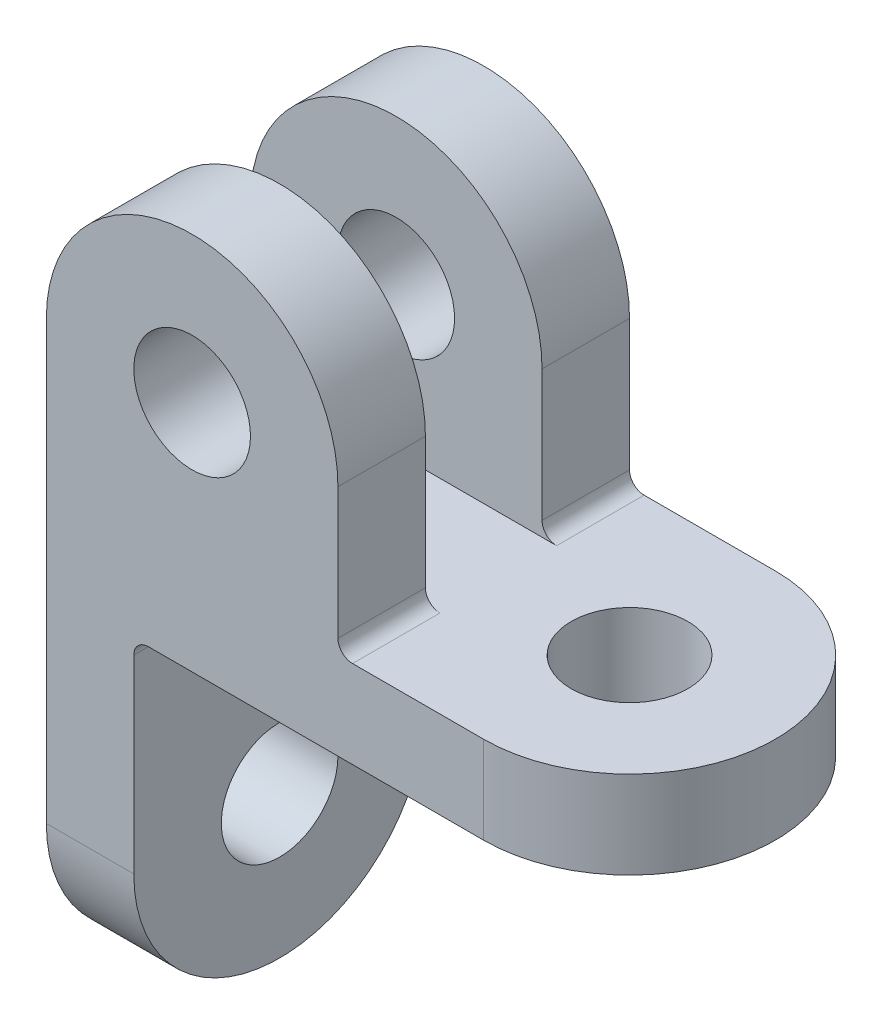
ISO-10303-21;
HEADER;
FILE_DESCRIPTION(('STEP AP214'),'2;1');
FILE_NAME('part.step','',(''),(''),'','','');
FILE_SCHEMA(('AUTOMOTIVE_DESIGN { 1 0 10303 214 1 1 1 1 }'));
ENDSEC;
DATA;
#1=APPLICATION_CONTEXT('core data for automotive mechanical design processes');
#2=APPLICATION_PROTOCOL_DEFINITION('international standard','automotive_design',2000,#1);
#3=PRODUCT_CONTEXT('',#1,'mechanical');
#4=PRODUCT('Part','Part','',(#3));
#5=PRODUCT_RELATED_PRODUCT_CATEGORY('part','',(#4));
#6=PRODUCT_DEFINITION_FORMATION('','',#4);
#7=PRODUCT_DEFINITION_CONTEXT('part definition',#1,'design');
#8=PRODUCT_DEFINITION('design','',#6,#7);
#9=PRODUCT_DEFINITION_SHAPE('','',#8);
#10=(LENGTH_UNIT() NAMED_UNIT(*) SI_UNIT(.MILLI.,.METRE.));
#11=(NAMED_UNIT(*) PLANE_ANGLE_UNIT() SI_UNIT($,.RADIAN.));
#12=(NAMED_UNIT(*) SI_UNIT($,.STERADIAN.) SOLID_ANGLE_UNIT());
#13=UNCERTAINTY_MEASURE_WITH_UNIT(LENGTH_MEASURE(1.E-05),#10,'distance_accuracy_value','');
#14=(GEOMETRIC_REPRESENTATION_CONTEXT(3) GLOBAL_UNCERTAINTY_ASSIGNED_CONTEXT((#13)) GLOBAL_UNIT_ASSIGNED_CONTEXT((#10,
#11,#12)) REPRESENTATION_CONTEXT('',''));
#15=CARTESIAN_POINT('',(0.,0.,0.));
#16=DIRECTION('',(0.,0.,1.));
#17=DIRECTION('',(1.,0.,0.));
#18=AXIS2_PLACEMENT_3D('',#15,#16,#17);
#19=CARTESIAN_POINT('',(0.,15.,0.));
#20=DIRECTION('',(-1.,0.,0.));
#21=DIRECTION('',(0.,-1.,0.));
#22=AXIS2_PLACEMENT_3D('',#19,#20,#21);
#23=CYLINDRICAL_SURFACE('',#22,15.);
#24=DIRECTION('',(-1.,0.,0.));
#25=VECTOR('',#24,1.);
#26=CARTESIAN_POINT('',(0.,15.,15.));
#27=LINE('',#26,#25);
#28=CARTESIAN_POINT('',(0.,15.,15.));
#29=VERTEX_POINT('',#28);
#30=CARTESIAN_POINT('',(8.99999999999999,15.,15.));
#31=VERTEX_POINT('',#30);
#32=EDGE_CURVE('E289',#29,#31,#27,.F.);
#33=ORIENTED_EDGE('',*,*,#32,.F.);
#34=CARTESIAN_POINT('',(0.,15.,0.));
#35=DIRECTION('',(1.,0.,0.));
#36=DIRECTION('',(0.,1.,0.));
#37=AXIS2_PLACEMENT_3D('',#34,#35,#36);
#38=CIRCLE('',#37,15.);
#39=CARTESIAN_POINT('',(0.,15.,-15.));
#40=VERTEX_POINT('',#39);
#41=EDGE_CURVE('E295',#40,#29,#38,.F.);
#42=ORIENTED_EDGE('',*,*,#41,.F.);
#43=DIRECTION('',(1.,0.,0.));
#44=VECTOR('',#43,1.);
#45=CARTESIAN_POINT('',(0.,15.,-15.));
#46=LINE('',#45,#44);
#47=CARTESIAN_POINT('',(8.99999999999999,15.,-15.));
#48=VERTEX_POINT('',#47);
#49=EDGE_CURVE('E162',#48,#40,#46,.F.);
#50=ORIENTED_EDGE('',*,*,#49,.F.);
#51=CARTESIAN_POINT('',(8.99999999999999,15.,0.));
#52=DIRECTION('',(1.,0.,0.));
#53=DIRECTION('',(0.,0.,-1.));
#54=AXIS2_PLACEMENT_3D('',#51,#52,#53);
#55=CIRCLE('',#54,15.);
#56=EDGE_CURVE('E298',#31,#48,#55,.T.);
#57=ORIENTED_EDGE('',*,*,#56,.F.);
#58=EDGE_LOOP('',(#33,#42,#50,#57));
#59=FACE_BOUND('',#58,.T.);
#60=ADVANCED_FACE('F47',(#59),#23,.T.);
#61=CARTESIAN_POINT('',(45.,36.,0.));
#62=DIRECTION('',(0.,-1.,0.));
#63=DIRECTION('',(0.,0.,-1.));
#64=AXIS2_PLACEMENT_3D('',#61,#62,#63);
#65=CYLINDRICAL_SURFACE('',#64,15.);
#66=DIRECTION('',(0.,-1.,0.));
#67=VECTOR('',#66,1.);
#68=CARTESIAN_POINT('',(45.,0.,15.));
#69=LINE('',#68,#67);
#70=CARTESIAN_POINT('',(45.,36.,15.));
#71=VERTEX_POINT('',#70);
#72=CARTESIAN_POINT('',(45.,45.,15.));
#73=VERTEX_POINT('',#72);
#74=EDGE_CURVE('E274',#71,#73,#69,.F.);
#75=ORIENTED_EDGE('',*,*,#74,.F.);
#76=CARTESIAN_POINT('',(45.,36.,0.));
#77=DIRECTION('',(0.,-1.,0.));
#78=DIRECTION('',(1.,0.,0.));
#79=AXIS2_PLACEMENT_3D('',#76,#77,#78);
#80=CIRCLE('',#79,15.);
#81=CARTESIAN_POINT('',(45.,36.,-15.));
#82=VERTEX_POINT('',#81);
#83=EDGE_CURVE('E282',#82,#71,#80,.T.);
#84=ORIENTED_EDGE('',*,*,#83,.F.);
#85=DIRECTION('',(0.,1.,0.));
#86=VECTOR('',#85,1.);
#87=CARTESIAN_POINT('',(45.,36.,-15.));
#88=LINE('',#87,#86);
#89=CARTESIAN_POINT('',(45.,45.,-15.));
#90=VERTEX_POINT('',#89);
#91=EDGE_CURVE('E278',#90,#82,#88,.F.);
#92=ORIENTED_EDGE('',*,*,#91,.F.);
#93=CARTESIAN_POINT('',(45.,45.,0.));
#94=DIRECTION('',(0.,1.,0.));
#95=DIRECTION('',(-1.,0.,0.));
#96=AXIS2_PLACEMENT_3D('',#93,#94,#95);
#97=CIRCLE('',#96,15.);
#98=EDGE_CURVE('E285',#73,#90,#97,.T.);
#99=ORIENTED_EDGE('',*,*,#98,.F.);
#100=EDGE_LOOP('',(#75,#84,#92,#99));
#101=FACE_BOUND('',#100,.T.);
#102=ADVANCED_FACE('F372',(#101),#65,.T.);
#103=CARTESIAN_POINT('',(0.,45.,15.));
#104=DIRECTION('',(0.,1.,0.));
#105=DIRECTION('',(-1.,0.,0.));
#106=AXIS2_PLACEMENT_3D('',#103,#104,#105);
#107=PLANE('',#106);
#108=CARTESIAN_POINT('',(45.,45.,0.));
#109=DIRECTION('',(0.,1.,0.));
#110=DIRECTION('',(0.,0.,1.));
#111=AXIS2_PLACEMENT_3D('',#108,#109,#110);
#112=CIRCLE('',#111,6.);
#113=CARTESIAN_POINT('',(45.,45.,6.));
#114=VERTEX_POINT('',#113);
#115=EDGE_CURVE('E637',#114,#114,#112,.T.);
#116=ORIENTED_EDGE('',*,*,#115,.F.);
#117=EDGE_LOOP('',(#116));
#118=FACE_BOUND('',#117,.T.);
#119=DIRECTION('',(1.,0.,0.));
#120=VECTOR('',#119,1.);
#121=CARTESIAN_POINT('',(0.,45.,-15.));
#122=LINE('',#121,#120);
#123=CARTESIAN_POINT('',(31.5,45.,-15.));
#124=VERTEX_POINT('',#123);
#125=EDGE_CURVE('E166',#124,#90,#122,.T.);
#126=ORIENTED_EDGE('',*,*,#125,.F.);
#127=DIRECTION('',(0.,0.,1.));
#128=VECTOR('',#127,1.);
#129=CARTESIAN_POINT('',(31.5,45.,15.));
#130=LINE('',#129,#128);
#131=CARTESIAN_POINT('',(31.5,45.,-6.));
#132=VERTEX_POINT('',#131);
#133=EDGE_CURVE('E305',#124,#132,#130,.T.);
#134=ORIENTED_EDGE('',*,*,#133,.T.);
#135=DIRECTION('',(-1.,0.,0.));
#136=VECTOR('',#135,1.);
#137=CARTESIAN_POINT('',(0.,45.,-6.));
#138=LINE('',#137,#136);
#139=CARTESIAN_POINT('',(0.,45.,-6.));
#140=VERTEX_POINT('',#139);
#141=EDGE_CURVE('E203',#132,#140,#138,.T.);
#142=ORIENTED_EDGE('',*,*,#141,.T.);
#143=DIRECTION('',(0.,0.,-1.));
#144=VECTOR('',#143,1.);
#145=CARTESIAN_POINT('',(0.,45.,15.));
#146=LINE('',#145,#144);
#147=CARTESIAN_POINT('',(0.,45.,6.));
#148=VERTEX_POINT('',#147);
#149=EDGE_CURVE('E265',#148,#140,#146,.T.);
#150=ORIENTED_EDGE('',*,*,#149,.F.);
#151=DIRECTION('',(-1.,0.,0.));
#152=VECTOR('',#151,1.);
#153=CARTESIAN_POINT('',(0.,45.,6.));
#154=LINE('',#153,#152);
#155=CARTESIAN_POINT('',(31.5,45.,6.));
#156=VERTEX_POINT('',#155);
#157=EDGE_CURVE('E238',#156,#148,#154,.T.);
#158=ORIENTED_EDGE('',*,*,#157,.F.);
#159=DIRECTION('',(0.,0.,-1.));
#160=VECTOR('',#159,1.);
#161=CARTESIAN_POINT('',(31.5,45.,15.));
#162=LINE('',#161,#160);
#163=CARTESIAN_POINT('',(31.5,45.,15.));
#164=VERTEX_POINT('',#163);
#165=EDGE_CURVE('E302',#156,#164,#162,.F.);
#166=ORIENTED_EDGE('',*,*,#165,.T.);
#167=DIRECTION('',(1.,0.,0.));
#168=VECTOR('',#167,1.);
#169=CARTESIAN_POINT('',(0.,45.,15.));
#170=LINE('',#169,#168);
#171=EDGE_CURVE('E250',#164,#73,#170,.T.);
#172=ORIENTED_EDGE('',*,*,#171,.T.);
#173=ORIENTED_EDGE('',*,*,#98,.T.);
#174=EDGE_LOOP('',(#126,#134,#142,#150,#158,#166,#172,#173));
#175=FACE_BOUND('',#174,.T.);
#176=ADVANCED_FACE('F374',(#118,#175),#107,.T.);
#177=CARTESIAN_POINT('',(0.,0.,15.));
#178=DIRECTION('',(1.,0.,0.));
#179=DIRECTION('',(0.,1.,0.));
#180=AXIS2_PLACEMENT_3D('',#177,#178,#179);
#181=PLANE('',#180);
#182=CARTESIAN_POINT('',(0.,15.,0.));
#183=DIRECTION('',(1.,0.,0.));
#184=DIRECTION('',(0.,1.,0.));
#185=AXIS2_PLACEMENT_3D('',#182,#183,#184);
#186=CIRCLE('',#185,6.);
#187=CARTESIAN_POINT('',(0.,21.,0.));
#188=VERTEX_POINT('',#187);
#189=EDGE_CURVE('E198',#188,#188,#186,.T.);
#190=ORIENTED_EDGE('',*,*,#189,.T.);
#191=EDGE_LOOP('',(#190));
#192=FACE_BOUND('',#191,.T.);
#193=DIRECTION('',(0.,-1.,0.));
#194=VECTOR('',#193,1.);
#195=CARTESIAN_POINT('',(0.,0.,-15.));
#196=LINE('',#195,#194);
#197=CARTESIAN_POINT('',(0.,60.,-15.));
#198=VERTEX_POINT('',#197);
#199=EDGE_CURVE('E153',#198,#40,#196,.T.);
#200=ORIENTED_EDGE('',*,*,#199,.T.);
#201=ORIENTED_EDGE('',*,*,#41,.T.);
#202=DIRECTION('',(0.,-1.,0.));
#203=VECTOR('',#202,1.);
#204=CARTESIAN_POINT('',(0.,0.,15.));
#205=LINE('',#204,#203);
#206=CARTESIAN_POINT('',(0.,60.,15.));
#207=VERTEX_POINT('',#206);
#208=EDGE_CURVE('E253',#207,#29,#205,.T.);
#209=ORIENTED_EDGE('',*,*,#208,.F.);
#210=DIRECTION('',(0.,0.,-1.));
#211=VECTOR('',#210,1.);
#212=CARTESIAN_POINT('',(0.,60.,15.));
#213=LINE('',#212,#211);
#214=CARTESIAN_POINT('',(0.,60.,6.));
#215=VERTEX_POINT('',#214);
#216=EDGE_CURVE('E247',#207,#215,#213,.T.);
#217=ORIENTED_EDGE('',*,*,#216,.T.);
#218=DIRECTION('',(0.,-1.,0.));
#219=VECTOR('',#218,1.);
#220=CARTESIAN_POINT('',(0.,0.,6.));
#221=LINE('',#220,#219);
#222=EDGE_CURVE('E234',#215,#148,#221,.T.);
#223=ORIENTED_EDGE('',*,*,#222,.T.);
#224=ORIENTED_EDGE('',*,*,#149,.T.);
#225=DIRECTION('',(0.,-1.,0.));
#226=VECTOR('',#225,1.);
#227=CARTESIAN_POINT('',(0.,0.,-6.));
#228=LINE('',#227,#226);
#229=CARTESIAN_POINT('',(0.,60.,-6.));
#230=VERTEX_POINT('',#229);
#231=EDGE_CURVE('E172',#230,#140,#228,.T.);
#232=ORIENTED_EDGE('',*,*,#231,.F.);
#233=DIRECTION('',(0.,0.,1.));
#234=VECTOR('',#233,1.);
#235=CARTESIAN_POINT('',(0.,60.,-15.));
#236=LINE('',#235,#234);
#237=EDGE_CURVE('E169',#198,#230,#236,.T.);
#238=ORIENTED_EDGE('',*,*,#237,.F.);
#239=EDGE_LOOP('',(#200,#201,#209,#217,#223,#224,#232,#238));
#240=FACE_BOUND('',#239,.T.);
#241=ADVANCED_FACE('F170',(#192,#240),#181,.F.);
#242=CARTESIAN_POINT('',(8.99999999999999,0.,15.));
#243=DIRECTION('',(1.,0.,0.));
#244=DIRECTION('',(0.,0.,-1.));
#245=AXIS2_PLACEMENT_3D('',#242,#243,#244);
#246=PLANE('',#245);
#247=CARTESIAN_POINT('',(9.,15.,0.));
#248=DIRECTION('',(1.,0.,0.));
#249=DIRECTION('',(0.,0.,-1.));
#250=AXIS2_PLACEMENT_3D('',#247,#248,#249);
#251=CIRCLE('',#250,6.);
#252=CARTESIAN_POINT('',(9.,15.,-6.));
#253=VERTEX_POINT('',#252);
#254=EDGE_CURVE('E628',#253,#253,#251,.T.);
#255=ORIENTED_EDGE('',*,*,#254,.F.);
#256=EDGE_LOOP('',(#255));
#257=FACE_BOUND('',#256,.T.);
#258=DIRECTION('',(0.,-1.,0.));
#259=VECTOR('',#258,1.);
#260=CARTESIAN_POINT('',(8.99999999999999,0.,-15.));
#261=LINE('',#260,#259);
#262=CARTESIAN_POINT('',(8.99999999999999,34.5,-15.));
#263=VERTEX_POINT('',#262);
#264=EDGE_CURVE('E165',#263,#48,#261,.T.);
#265=ORIENTED_EDGE('',*,*,#264,.F.);
#266=DIRECTION('',(0.,0.,-1.));
#267=VECTOR('',#266,1.);
#268=CARTESIAN_POINT('',(8.99999999999999,34.5,15.));
#269=LINE('',#268,#267);
#270=CARTESIAN_POINT('',(8.99999999999999,34.5,15.));
#271=VERTEX_POINT('',#270);
#272=EDGE_CURVE('E69',#263,#271,#269,.F.);
#273=ORIENTED_EDGE('',*,*,#272,.T.);
#274=DIRECTION('',(0.,-1.,0.));
#275=VECTOR('',#274,1.);
#276=CARTESIAN_POINT('',(8.99999999999999,0.,15.));
#277=LINE('',#276,#275);
#278=EDGE_CURVE('E258',#271,#31,#277,.T.);
#279=ORIENTED_EDGE('',*,*,#278,.T.);
#280=ORIENTED_EDGE('',*,*,#56,.T.);
#281=EDGE_LOOP('',(#265,#273,#279,#280));
#282=FACE_BOUND('',#281,.T.);
#283=ADVANCED_FACE('F359',(#257,#282),#246,.T.);
#284=CARTESIAN_POINT('',(0.,36.,15.));
#285=DIRECTION('',(0.,-1.,0.));
#286=DIRECTION('',(1.,0.,0.));
#287=AXIS2_PLACEMENT_3D('',#284,#285,#286);
#288=PLANE('',#287);
#289=CARTESIAN_POINT('',(45.,36.,0.));
#290=DIRECTION('',(0.,-1.,0.));
#291=DIRECTION('',(1.,0.,0.));
#292=AXIS2_PLACEMENT_3D('',#289,#290,#291);
#293=CIRCLE('',#292,6.);
#294=CARTESIAN_POINT('',(51.,36.,0.));
#295=VERTEX_POINT('',#294);
#296=EDGE_CURVE('E631',#295,#295,#293,.T.);
#297=ORIENTED_EDGE('',*,*,#296,.F.);
#298=EDGE_LOOP('',(#297));
#299=FACE_BOUND('',#298,.T.);
#300=DIRECTION('',(-1.,0.,0.));
#301=VECTOR('',#300,1.);
#302=CARTESIAN_POINT('',(0.,36.,15.));
#303=LINE('',#302,#301);
#304=CARTESIAN_POINT('',(10.5,36.,15.));
#305=VERTEX_POINT('',#304);
#306=EDGE_CURVE('E261',#71,#305,#303,.T.);
#307=ORIENTED_EDGE('',*,*,#306,.T.);
#308=DIRECTION('',(0.,0.,-1.));
#309=VECTOR('',#308,1.);
#310=CARTESIAN_POINT('',(10.5,36.,-15.));
#311=LINE('',#310,#309);
#312=CARTESIAN_POINT('',(10.5,36.,-15.));
#313=VERTEX_POINT('',#312);
#314=EDGE_CURVE('E316',#305,#313,#311,.T.);
#315=ORIENTED_EDGE('',*,*,#314,.T.);
#316=DIRECTION('',(-1.,0.,0.));
#317=VECTOR('',#316,1.);
#318=CARTESIAN_POINT('',(0.,36.,-15.));
#319=LINE('',#318,#317);
#320=EDGE_CURVE('E254',#82,#313,#319,.T.);
#321=ORIENTED_EDGE('',*,*,#320,.F.);
#322=ORIENTED_EDGE('',*,*,#83,.T.);
#323=EDGE_LOOP('',(#307,#315,#321,#322));
#324=FACE_BOUND('',#323,.T.);
#325=ADVANCED_FACE('F366',(#299,#324),#288,.T.);
#326=CARTESIAN_POINT('',(0.,0.,15.));
#327=DIRECTION('',(0.,0.,1.));
#328=DIRECTION('',(1.,0.,0.));
#329=AXIS2_PLACEMENT_3D('',#326,#327,#328);
#330=PLANE('',#329);
#331=ORIENTED_EDGE('',*,*,#208,.T.);
#332=ORIENTED_EDGE('',*,*,#32,.T.);
#333=ORIENTED_EDGE('',*,*,#278,.F.);
#334=CARTESIAN_POINT('',(10.5,34.5,15.));
#335=DIRECTION('',(0.,0.,1.));
#336=DIRECTION('',(1.,0.,0.));
#337=AXIS2_PLACEMENT_3D('',#334,#335,#336);
#338=CIRCLE('',#337,1.5);
#339=EDGE_CURVE('E11',#271,#305,#338,.F.);
#340=ORIENTED_EDGE('',*,*,#339,.T.);
#341=ORIENTED_EDGE('',*,*,#306,.F.);
#342=ORIENTED_EDGE('',*,*,#74,.T.);
#343=ORIENTED_EDGE('',*,*,#171,.F.);
#344=CARTESIAN_POINT('',(31.5,46.5,15.));
#345=DIRECTION('',(0.,0.,1.));
#346=DIRECTION('',(1.,0.,0.));
#347=AXIS2_PLACEMENT_3D('',#344,#345,#346);
#348=CIRCLE('',#347,1.5);
#349=CARTESIAN_POINT('',(30.,46.5,15.));
#350=VERTEX_POINT('',#349);
#351=EDGE_CURVE('E332',#164,#350,#348,.F.);
#352=ORIENTED_EDGE('',*,*,#351,.T.);
#353=DIRECTION('',(0.,-1.,0.));
#354=VECTOR('',#353,1.);
#355=CARTESIAN_POINT('',(30.,0.,15.));
#356=LINE('',#355,#354);
#357=CARTESIAN_POINT('',(30.,60.,15.));
#358=VERTEX_POINT('',#357);
#359=EDGE_CURVE('E222',#358,#350,#356,.T.);
#360=ORIENTED_EDGE('',*,*,#359,.F.);
#361=CARTESIAN_POINT('',(15.,60.,15.));
#362=DIRECTION('',(0.,0.,1.));
#363=DIRECTION('',(1.,0.,0.));
#364=AXIS2_PLACEMENT_3D('',#361,#362,#363);
#365=CIRCLE('',#364,15.);
#366=EDGE_CURVE('E217',#207,#358,#365,.F.);
#367=ORIENTED_EDGE('',*,*,#366,.F.);
#368=EDGE_LOOP('',(#331,#332,#333,#340,#341,#342,#343,#352,#360,#367));
#369=FACE_BOUND('',#368,.T.);
#370=CARTESIAN_POINT('',(15.,60.,15.));
#371=DIRECTION('',(0.,0.,1.));
#372=DIRECTION('',(1.,0.,0.));
#373=AXIS2_PLACEMENT_3D('',#370,#371,#372);
#374=CIRCLE('',#373,6.);
#375=CARTESIAN_POINT('',(21.,60.,15.));
#376=VERTEX_POINT('',#375);
#377=EDGE_CURVE('E213',#376,#376,#374,.T.);
#378=ORIENTED_EDGE('',*,*,#377,.F.);
#379=EDGE_LOOP('',(#378));
#380=FACE_BOUND('',#379,.T.);
#381=ADVANCED_FACE('F339',(#369,#380),#330,.T.);
#382=CARTESIAN_POINT('',(0.,0.,-15.));
#383=DIRECTION('',(0.,0.,1.));
#384=DIRECTION('',(1.,0.,0.));
#385=AXIS2_PLACEMENT_3D('',#382,#383,#384);
#386=PLANE('',#385);
#387=ORIENTED_EDGE('',*,*,#320,.T.);
#388=CARTESIAN_POINT('',(10.5,34.5,-15.));
#389=DIRECTION('',(0.,0.,1.));
#390=DIRECTION('',(1.,0.,0.));
#391=AXIS2_PLACEMENT_3D('',#388,#389,#390);
#392=CIRCLE('',#391,1.5);
#393=EDGE_CURVE('E56',#313,#263,#392,.T.);
#394=ORIENTED_EDGE('',*,*,#393,.T.);
#395=ORIENTED_EDGE('',*,*,#264,.T.);
#396=ORIENTED_EDGE('',*,*,#49,.T.);
#397=ORIENTED_EDGE('',*,*,#199,.F.);
#398=CARTESIAN_POINT('',(15.,60.,-15.));
#399=DIRECTION('',(0.,0.,1.));
#400=DIRECTION('',(1.,0.,0.));
#401=AXIS2_PLACEMENT_3D('',#398,#399,#400);
#402=CIRCLE('',#401,15.);
#403=CARTESIAN_POINT('',(30.,60.,-15.));
#404=VERTEX_POINT('',#403);
#405=EDGE_CURVE('E159',#198,#404,#402,.F.);
#406=ORIENTED_EDGE('',*,*,#405,.T.);
#407=DIRECTION('',(0.,-1.,0.));
#408=VECTOR('',#407,1.);
#409=CARTESIAN_POINT('',(30.,0.,-15.));
#410=LINE('',#409,#408);
#411=CARTESIAN_POINT('',(30.,46.5,-15.));
#412=VERTEX_POINT('',#411);
#413=EDGE_CURVE('E178',#404,#412,#410,.T.);
#414=ORIENTED_EDGE('',*,*,#413,.T.);
#415=CARTESIAN_POINT('',(31.5,46.5,-15.));
#416=DIRECTION('',(0.,0.,1.));
#417=DIRECTION('',(1.,0.,0.));
#418=AXIS2_PLACEMENT_3D('',#415,#416,#417);
#419=CIRCLE('',#418,1.5);
#420=EDGE_CURVE('E325',#412,#124,#419,.T.);
#421=ORIENTED_EDGE('',*,*,#420,.T.);
#422=ORIENTED_EDGE('',*,*,#125,.T.);
#423=ORIENTED_EDGE('',*,*,#91,.T.);
#424=EDGE_LOOP('',(#387,#394,#395,#396,#397,#406,#414,#421,#422,#423));
#425=FACE_BOUND('',#424,.T.);
#426=CARTESIAN_POINT('',(15.,60.,-15.));
#427=DIRECTION('',(0.,0.,1.));
#428=DIRECTION('',(1.,0.,0.));
#429=AXIS2_PLACEMENT_3D('',#426,#427,#428);
#430=CIRCLE('',#429,6.);
#431=CARTESIAN_POINT('',(21.,60.,-15.));
#432=VERTEX_POINT('',#431);
#433=EDGE_CURVE('E183',#432,#432,#430,.T.);
#434=ORIENTED_EDGE('',*,*,#433,.T.);
#435=EDGE_LOOP('',(#434));
#436=FACE_BOUND('',#435,.T.);
#437=ADVANCED_FACE('F155',(#425,#436),#386,.F.);
#438=CARTESIAN_POINT('',(15.,60.,15.));
#439=DIRECTION('',(0.,0.,-1.));
#440=DIRECTION('',(-1.,0.,0.));
#441=AXIS2_PLACEMENT_3D('',#438,#439,#440);
#442=CYLINDRICAL_SURFACE('',#441,15.);
#443=CARTESIAN_POINT('',(15.,60.,6.));
#444=DIRECTION('',(0.,0.,1.));
#445=DIRECTION('',(1.,0.,0.));
#446=AXIS2_PLACEMENT_3D('',#443,#444,#445);
#447=CIRCLE('',#446,15.);
#448=CARTESIAN_POINT('',(30.,60.,6.));
#449=VERTEX_POINT('',#448);
#450=EDGE_CURVE('E230',#215,#449,#447,.F.);
#451=ORIENTED_EDGE('',*,*,#450,.F.);
#452=ORIENTED_EDGE('',*,*,#216,.F.);
#453=ORIENTED_EDGE('',*,*,#366,.T.);
#454=DIRECTION('',(0.,0.,-1.));
#455=VECTOR('',#454,1.);
#456=CARTESIAN_POINT('',(30.,60.,15.));
#457=LINE('',#456,#455);
#458=EDGE_CURVE('E226',#358,#449,#457,.T.);
#459=ORIENTED_EDGE('',*,*,#458,.T.);
#460=EDGE_LOOP('',(#451,#452,#453,#459));
#461=FACE_BOUND('',#460,.T.);
#462=ADVANCED_FACE('F355',(#461),#442,.T.);
#463=CARTESIAN_POINT('',(15.,60.,15.));
#464=DIRECTION('',(0.,0.,-1.));
#465=DIRECTION('',(-1.,0.,0.));
#466=AXIS2_PLACEMENT_3D('',#463,#464,#465);
#467=CYLINDRICAL_SURFACE('',#466,6.);
#468=ORIENTED_EDGE('',*,*,#377,.T.);
#469=EDGE_LOOP('',(#468));
#470=FACE_BOUND('',#469,.T.);
#471=CARTESIAN_POINT('',(15.,60.,6.));
#472=DIRECTION('',(0.,0.,1.));
#473=DIRECTION('',(1.,0.,0.));
#474=AXIS2_PLACEMENT_3D('',#471,#472,#473);
#475=CIRCLE('',#474,6.);
#476=CARTESIAN_POINT('',(21.,60.,6.));
#477=VERTEX_POINT('',#476);
#478=EDGE_CURVE('E211',#477,#477,#475,.T.);
#479=ORIENTED_EDGE('',*,*,#478,.F.);
#480=EDGE_LOOP('',(#479));
#481=FACE_BOUND('',#480,.T.);
#482=ADVANCED_FACE('F470',(#470,#481),#467,.F.);
#483=CARTESIAN_POINT('',(30.,0.,15.));
#484=DIRECTION('',(1.,0.,0.));
#485=DIRECTION('',(0.,0.,-1.));
#486=AXIS2_PLACEMENT_3D('',#483,#484,#485);
#487=PLANE('',#486);
#488=ORIENTED_EDGE('',*,*,#359,.T.);
#489=DIRECTION('',(0.,0.,-1.));
#490=VECTOR('',#489,1.);
#491=CARTESIAN_POINT('',(30.,46.5,6.));
#492=LINE('',#491,#490);
#493=CARTESIAN_POINT('',(30.,46.5,6.));
#494=VERTEX_POINT('',#493);
#495=EDGE_CURVE('E312',#350,#494,#492,.T.);
#496=ORIENTED_EDGE('',*,*,#495,.T.);
#497=DIRECTION('',(0.,-1.,0.));
#498=VECTOR('',#497,1.);
#499=CARTESIAN_POINT('',(30.,0.,6.));
#500=LINE('',#499,#498);
#501=EDGE_CURVE('E218',#449,#494,#500,.T.);
#502=ORIENTED_EDGE('',*,*,#501,.F.);
#503=ORIENTED_EDGE('',*,*,#458,.F.);
#504=EDGE_LOOP('',(#488,#496,#502,#503));
#505=FACE_BOUND('',#504,.T.);
#506=ADVANCED_FACE('F346',(#505),#487,.T.);
#507=CARTESIAN_POINT('',(0.,0.,6.));
#508=DIRECTION('',(0.,0.,1.));
#509=DIRECTION('',(1.,0.,0.));
#510=AXIS2_PLACEMENT_3D('',#507,#508,#509);
#511=PLANE('',#510);
#512=ORIENTED_EDGE('',*,*,#478,.T.);
#513=EDGE_LOOP('',(#512));
#514=FACE_BOUND('',#513,.T.);
#515=ORIENTED_EDGE('',*,*,#450,.T.);
#516=ORIENTED_EDGE('',*,*,#501,.T.);
#517=CARTESIAN_POINT('',(31.5,46.5,6.));
#518=DIRECTION('',(0.,0.,1.));
#519=DIRECTION('',(1.,0.,0.));
#520=AXIS2_PLACEMENT_3D('',#517,#518,#519);
#521=CIRCLE('',#520,1.5);
#522=EDGE_CURVE('E328',#494,#156,#521,.T.);
#523=ORIENTED_EDGE('',*,*,#522,.T.);
#524=ORIENTED_EDGE('',*,*,#157,.T.);
#525=ORIENTED_EDGE('',*,*,#222,.F.);
#526=EDGE_LOOP('',(#515,#516,#523,#524,#525));
#527=FACE_BOUND('',#526,.T.);
#528=ADVANCED_FACE('F350',(#514,#527),#511,.F.);
#529=CARTESIAN_POINT('',(15.,60.,-15.));
#530=DIRECTION('',(0.,0.,1.));
#531=DIRECTION('',(1.,0.,0.));
#532=AXIS2_PLACEMENT_3D('',#529,#530,#531);
#533=CYLINDRICAL_SURFACE('',#532,15.);
#534=CARTESIAN_POINT('',(15.,60.,-6.));
#535=DIRECTION('',(0.,0.,1.));
#536=DIRECTION('',(1.,0.,0.));
#537=AXIS2_PLACEMENT_3D('',#534,#535,#536);
#538=CIRCLE('',#537,15.);
#539=CARTESIAN_POINT('',(30.,60.,-6.));
#540=VERTEX_POINT('',#539);
#541=EDGE_CURVE('E197',#230,#540,#538,.F.);
#542=ORIENTED_EDGE('',*,*,#541,.T.);
#543=DIRECTION('',(0.,0.,1.));
#544=VECTOR('',#543,1.);
#545=CARTESIAN_POINT('',(30.,60.,-15.));
#546=LINE('',#545,#544);
#547=EDGE_CURVE('E177',#404,#540,#546,.T.);
#548=ORIENTED_EDGE('',*,*,#547,.F.);
#549=ORIENTED_EDGE('',*,*,#405,.F.);
#550=ORIENTED_EDGE('',*,*,#237,.T.);
#551=EDGE_LOOP('',(#542,#548,#549,#550));
#552=FACE_BOUND('',#551,.T.);
#553=ADVANCED_FACE('F180',(#552),#533,.T.);
#554=CARTESIAN_POINT('',(30.,0.,-15.));
#555=DIRECTION('',(-1.,0.,0.));
#556=DIRECTION('',(0.,0.,1.));
#557=AXIS2_PLACEMENT_3D('',#554,#555,#556);
#558=PLANE('',#557);
#559=DIRECTION('',(0.,-1.,0.));
#560=VECTOR('',#559,1.);
#561=CARTESIAN_POINT('',(30.,0.,-6.));
#562=LINE('',#561,#560);
#563=CARTESIAN_POINT('',(30.,46.5,-6.));
#564=VERTEX_POINT('',#563);
#565=EDGE_CURVE('E189',#540,#564,#562,.T.);
#566=ORIENTED_EDGE('',*,*,#565,.T.);
#567=DIRECTION('',(0.,0.,1.));
#568=VECTOR('',#567,1.);
#569=CARTESIAN_POINT('',(30.,46.5,-15.));
#570=LINE('',#569,#568);
#571=EDGE_CURVE('E309',#564,#412,#570,.F.);
#572=ORIENTED_EDGE('',*,*,#571,.T.);
#573=ORIENTED_EDGE('',*,*,#413,.F.);
#574=ORIENTED_EDGE('',*,*,#547,.T.);
#575=EDGE_LOOP('',(#566,#572,#573,#574));
#576=FACE_BOUND('',#575,.T.);
#577=ADVANCED_FACE('F384',(#576),#558,.F.);
#578=CARTESIAN_POINT('',(15.,60.,-15.));
#579=DIRECTION('',(0.,0.,1.));
#580=DIRECTION('',(1.,0.,0.));
#581=AXIS2_PLACEMENT_3D('',#578,#579,#580);
#582=CYLINDRICAL_SURFACE('',#581,6.);
#583=ORIENTED_EDGE('',*,*,#433,.F.);
#584=EDGE_LOOP('',(#583));
#585=FACE_BOUND('',#584,.T.);
#586=CARTESIAN_POINT('',(15.,60.,-6.));
#587=DIRECTION('',(0.,0.,1.));
#588=DIRECTION('',(1.,0.,0.));
#589=AXIS2_PLACEMENT_3D('',#586,#587,#588);
#590=CIRCLE('',#589,6.);
#591=CARTESIAN_POINT('',(21.,60.,-6.));
#592=VERTEX_POINT('',#591);
#593=EDGE_CURVE('E193',#592,#592,#590,.T.);
#594=ORIENTED_EDGE('',*,*,#593,.T.);
#595=EDGE_LOOP('',(#594));
#596=FACE_BOUND('',#595,.T.);
#597=ADVANCED_FACE('F386',(#585,#596),#582,.F.);
#598=CARTESIAN_POINT('',(0.,0.,-6.));
#599=DIRECTION('',(0.,0.,1.));
#600=DIRECTION('',(1.,0.,0.));
#601=AXIS2_PLACEMENT_3D('',#598,#599,#600);
#602=PLANE('',#601);
#603=ORIENTED_EDGE('',*,*,#593,.F.);
#604=EDGE_LOOP('',(#603));
#605=FACE_BOUND('',#604,.T.);
#606=ORIENTED_EDGE('',*,*,#541,.F.);
#607=ORIENTED_EDGE('',*,*,#231,.T.);
#608=ORIENTED_EDGE('',*,*,#141,.F.);
#609=CARTESIAN_POINT('',(31.5,46.5,-6.));
#610=DIRECTION('',(0.,0.,1.));
#611=DIRECTION('',(1.,0.,0.));
#612=AXIS2_PLACEMENT_3D('',#609,#610,#611);
#613=CIRCLE('',#612,1.5);
#614=EDGE_CURVE('E322',#132,#564,#613,.F.);
#615=ORIENTED_EDGE('',*,*,#614,.T.);
#616=ORIENTED_EDGE('',*,*,#565,.F.);
#617=EDGE_LOOP('',(#606,#607,#608,#615,#616));
#618=FACE_BOUND('',#617,.T.);
#619=ADVANCED_FACE('F378',(#605,#618),#602,.T.);
#620=CARTESIAN_POINT('',(8.99999999999999,15.,0.));
#621=DIRECTION('',(1.,0.,0.));
#622=DIRECTION('',(0.,0.,-1.));
#623=AXIS2_PLACEMENT_3D('',#620,#621,#622);
#624=CYLINDRICAL_SURFACE('',#623,6.);
#625=ORIENTED_EDGE('',*,*,#189,.F.);
#626=EDGE_LOOP('',(#625));
#627=FACE_BOUND('',#626,.T.);
#628=ORIENTED_EDGE('',*,*,#254,.T.);
#629=EDGE_LOOP('',(#628));
#630=FACE_BOUND('',#629,.T.);
#631=ADVANCED_FACE('F439',(#627,#630),#624,.F.);
#632=CARTESIAN_POINT('',(45.,45.,0.));
#633=DIRECTION('',(0.,1.,0.));
#634=DIRECTION('',(0.,0.,1.));
#635=AXIS2_PLACEMENT_3D('',#632,#633,#634);
#636=CYLINDRICAL_SURFACE('',#635,6.);
#637=ORIENTED_EDGE('',*,*,#115,.T.);
#638=EDGE_LOOP('',(#637));
#639=FACE_BOUND('',#638,.T.);
#640=ORIENTED_EDGE('',*,*,#296,.T.);
#641=EDGE_LOOP('',(#640));
#642=FACE_BOUND('',#641,.T.);
#643=ADVANCED_FACE('F409',(#639,#642),#636,.F.);
#644=CARTESIAN_POINT('',(31.5,46.5,15.));
#645=DIRECTION('',(0.,0.,1.));
#646=DIRECTION('',(1.,0.,0.));
#647=AXIS2_PLACEMENT_3D('',#644,#645,#646);
#648=CYLINDRICAL_SURFACE('',#647,1.5);
#649=ORIENTED_EDGE('',*,*,#420,.F.);
#650=ORIENTED_EDGE('',*,*,#571,.F.);
#651=ORIENTED_EDGE('',*,*,#614,.F.);
#652=ORIENTED_EDGE('',*,*,#133,.F.);
#653=EDGE_LOOP('',(#649,#650,#651,#652));
#654=FACE_BOUND('',#653,.T.);
#655=ADVANCED_FACE('F382',(#654),#648,.F.);
#656=CARTESIAN_POINT('',(31.5,46.5,15.));
#657=DIRECTION('',(0.,0.,1.));
#658=DIRECTION('',(1.,0.,0.));
#659=AXIS2_PLACEMENT_3D('',#656,#657,#658);
#660=CYLINDRICAL_SURFACE('',#659,1.5);
#661=ORIENTED_EDGE('',*,*,#351,.F.);
#662=ORIENTED_EDGE('',*,*,#165,.F.);
#663=ORIENTED_EDGE('',*,*,#522,.F.);
#664=ORIENTED_EDGE('',*,*,#495,.F.);
#665=EDGE_LOOP('',(#661,#662,#663,#664));
#666=FACE_BOUND('',#665,.T.);
#667=ADVANCED_FACE('F348',(#666),#660,.F.);
#668=CARTESIAN_POINT('',(10.5,34.5,15.));
#669=DIRECTION('',(0.,0.,1.));
#670=DIRECTION('',(1.,0.,0.));
#671=AXIS2_PLACEMENT_3D('',#668,#669,#670);
#672=CYLINDRICAL_SURFACE('',#671,1.5);
#673=ORIENTED_EDGE('',*,*,#339,.F.);
#674=ORIENTED_EDGE('',*,*,#272,.F.);
#675=ORIENTED_EDGE('',*,*,#393,.F.);
#676=ORIENTED_EDGE('',*,*,#314,.F.);
#677=EDGE_LOOP('',(#673,#674,#675,#676));
#678=FACE_BOUND('',#677,.T.);
#679=ADVANCED_FACE('F49',(#678),#672,.F.);
#680=CLOSED_SHELL('',(#60,#102,#176,#241,#283,#325,#381,#437,#462,#482,#506,#528,#553,#577,#597,
#619,#631,#643,#655,#667,#679));
#681=MANIFOLD_SOLID_BREP('B2',#680);
#682=ADVANCED_BREP_SHAPE_REPRESENTATION('',(#18,#681),#14);
#683=SHAPE_DEFINITION_REPRESENTATION(#9,#682);
ENDSEC;
END-ISO-10303-21;
